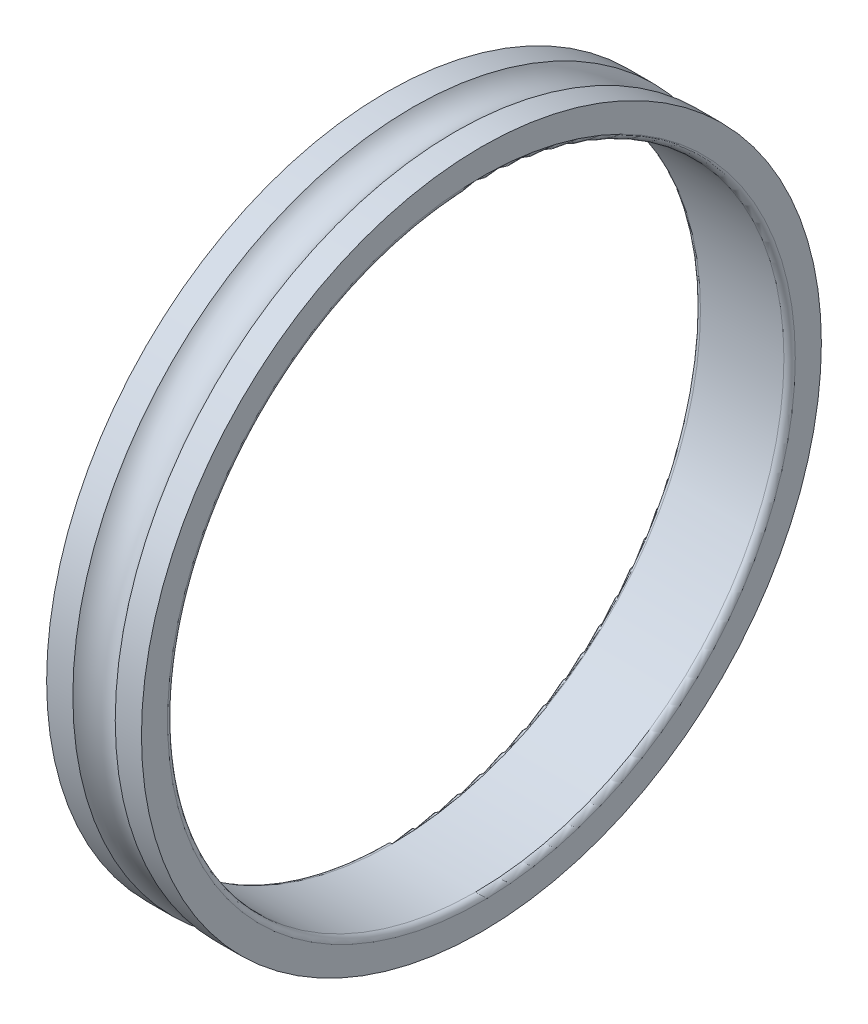
ISO-10303-21;
HEADER;
FILE_DESCRIPTION(('STEP AP214'),'2;1');
FILE_NAME('part.step','',(''),(''),'','','');
FILE_SCHEMA(('AUTOMOTIVE_DESIGN { 1 0 10303 214 1 1 1 1 }'));
ENDSEC;
DATA;
#1=APPLICATION_CONTEXT('core data for automotive mechanical design processes');
#2=APPLICATION_PROTOCOL_DEFINITION('international standard','automotive_design',2000,#1);
#3=PRODUCT_CONTEXT('',#1,'mechanical');
#4=PRODUCT('Part','Part','',(#3));
#5=PRODUCT_RELATED_PRODUCT_CATEGORY('part','',(#4));
#6=PRODUCT_DEFINITION_FORMATION('','',#4);
#7=PRODUCT_DEFINITION_CONTEXT('part definition',#1,'design');
#8=PRODUCT_DEFINITION('design','',#6,#7);
#9=PRODUCT_DEFINITION_SHAPE('','',#8);
#10=(LENGTH_UNIT() NAMED_UNIT(*) SI_UNIT(.MILLI.,.METRE.));
#11=(NAMED_UNIT(*) PLANE_ANGLE_UNIT() SI_UNIT($,.RADIAN.));
#12=(NAMED_UNIT(*) SI_UNIT($,.STERADIAN.) SOLID_ANGLE_UNIT());
#13=UNCERTAINTY_MEASURE_WITH_UNIT(LENGTH_MEASURE(1.E-05),#10,'distance_accuracy_value','');
#14=(GEOMETRIC_REPRESENTATION_CONTEXT(3) GLOBAL_UNCERTAINTY_ASSIGNED_CONTEXT((#13)) GLOBAL_UNIT_ASSIGNED_CONTEXT((#10,
#11,#12)) REPRESENTATION_CONTEXT('',''));
#15=CARTESIAN_POINT('',(0.,0.,0.));
#16=DIRECTION('',(0.,0.,1.));
#17=DIRECTION('',(1.,0.,0.));
#18=AXIS2_PLACEMENT_3D('',#15,#16,#17);
#19=CARTESIAN_POINT('',(-0.00126618526032918,0.,0.));
#20=DIRECTION('',(1.,0.,0.));
#21=DIRECTION('',(0.,0.,-1.));
#22=AXIS2_PLACEMENT_3D('',#19,#20,#21);
#23=CYLINDRICAL_SURFACE('',#22,35.85);
#24=CARTESIAN_POINT('',(0.,0.,0.));
#25=DIRECTION('',(1.,0.,0.));
#26=DIRECTION('',(0.,0.,-1.));
#27=AXIS2_PLACEMENT_3D('',#24,#25,#26);
#28=CIRCLE('',#27,35.85);
#29=CARTESIAN_POINT('',(0.,0.,-35.85));
#30=VERTEX_POINT('',#29);
#31=EDGE_CURVE('E10',#30,#30,#28,.T.);
#32=ORIENTED_EDGE('',*,*,#31,.T.);
#33=EDGE_LOOP('',(#32));
#34=FACE_BOUND('',#33,.T.);
#35=CARTESIAN_POINT('',(2.7650986598957,0.,0.));
#36=DIRECTION('',(1.,0.,0.));
#37=DIRECTION('',(0.,0.,-1.));
#38=AXIS2_PLACEMENT_3D('',#35,#36,#37);
#39=CIRCLE('',#38,35.85);
#40=CARTESIAN_POINT('',(2.7650986598957,0.,-35.85));
#41=VERTEX_POINT('',#40);
#42=EDGE_CURVE('E60',#41,#41,#39,.T.);
#43=ORIENTED_EDGE('',*,*,#42,.F.);
#44=EDGE_LOOP('',(#43));
#45=FACE_BOUND('',#44,.T.);
#46=ADVANCED_FACE('F32',(#34,#45),#23,.T.);
#47=CARTESIAN_POINT('',(0.,35.85,0.));
#48=DIRECTION('',(-1.,0.,0.));
#49=DIRECTION('',(0.,0.,1.));
#50=AXIS2_PLACEMENT_3D('',#47,#48,#49);
#51=PLANE('',#50);
#52=CARTESIAN_POINT('',(0.,0.,0.));
#53=DIRECTION('',(1.,0.,0.));
#54=DIRECTION('',(0.,0.,-1.));
#55=AXIS2_PLACEMENT_3D('',#52,#53,#54);
#56=CIRCLE('',#55,33.1);
#57=CARTESIAN_POINT('',(0.,0.,-33.1));
#58=VERTEX_POINT('',#57);
#59=EDGE_CURVE('E38',#58,#58,#56,.T.);
#60=ORIENTED_EDGE('',*,*,#59,.T.);
#61=EDGE_LOOP('',(#60));
#62=FACE_BOUND('',#61,.T.);
#63=ORIENTED_EDGE('',*,*,#31,.F.);
#64=EDGE_LOOP('',(#63));
#65=FACE_BOUND('',#64,.T.);
#66=ADVANCED_FACE('F68',(#62,#65),#51,.T.);
#67=CARTESIAN_POINT('',(0.600000000017342,0.,0.));
#68=DIRECTION('',(1.,0.,0.));
#69=DIRECTION('',(0.,0.,-1.));
#70=AXIS2_PLACEMENT_3D('',#67,#68,#69);
#71=TOROIDAL_SURFACE('',#70,33.1,0.600000000017339);
#72=CARTESIAN_POINT('',(0.600000000017342,0.,0.));
#73=DIRECTION('',(1.,0.,0.));
#74=DIRECTION('',(0.,0.,-1.));
#75=AXIS2_PLACEMENT_3D('',#72,#73,#74);
#76=CIRCLE('',#75,32.4999999999827);
#77=CARTESIAN_POINT('',(0.600000000017342,0.,-32.4999999999827));
#78=VERTEX_POINT('',#77);
#79=EDGE_CURVE('E42',#78,#78,#76,.T.);
#80=ORIENTED_EDGE('',*,*,#79,.T.);
#81=EDGE_LOOP('',(#80));
#82=FACE_BOUND('',#81,.T.);
#83=ORIENTED_EDGE('',*,*,#59,.F.);
#84=EDGE_LOOP('',(#83));
#85=FACE_BOUND('',#84,.T.);
#86=ADVANCED_FACE('F72',(#82,#85),#71,.T.);
#87=CARTESIAN_POINT('',(-0.00126618526032918,0.,0.));
#88=DIRECTION('',(1.,0.,0.));
#89=DIRECTION('',(0.,0.,-1.));
#90=AXIS2_PLACEMENT_3D('',#87,#88,#89);
#91=CYLINDRICAL_SURFACE('',#90,32.4999999999827);
#92=CARTESIAN_POINT('',(9.40000000001747,0.,0.));
#93=DIRECTION('',(1.,0.,0.));
#94=DIRECTION('',(0.,0.,-1.));
#95=AXIS2_PLACEMENT_3D('',#92,#93,#94);
#96=CIRCLE('',#95,32.4999999999826);
#97=CARTESIAN_POINT('',(9.40000000001747,0.,-32.4999999999826));
#98=VERTEX_POINT('',#97);
#99=EDGE_CURVE('E46',#98,#98,#96,.T.);
#100=ORIENTED_EDGE('',*,*,#99,.T.);
#101=EDGE_LOOP('',(#100));
#102=FACE_BOUND('',#101,.T.);
#103=ORIENTED_EDGE('',*,*,#79,.F.);
#104=EDGE_LOOP('',(#103));
#105=FACE_BOUND('',#104,.T.);
#106=ADVANCED_FACE('F76',(#102,#105),#91,.F.);
#107=CARTESIAN_POINT('',(9.40000000001747,0.,0.));
#108=DIRECTION('',(1.,0.,0.));
#109=DIRECTION('',(0.,0.,-1.));
#110=AXIS2_PLACEMENT_3D('',#107,#108,#109);
#111=TOROIDAL_SURFACE('',#110,33.0999999999826,0.599999999999965);
#112=CARTESIAN_POINT('',(10.0000000000174,0.,0.));
#113=DIRECTION('',(1.,0.,0.));
#114=DIRECTION('',(0.,0.,-1.));
#115=AXIS2_PLACEMENT_3D('',#112,#113,#114);
#116=CIRCLE('',#115,33.0999999999826);
#117=CARTESIAN_POINT('',(10.0000000000174,0.,-33.0999999999826));
#118=VERTEX_POINT('',#117);
#119=EDGE_CURVE('E51',#118,#118,#116,.T.);
#120=ORIENTED_EDGE('',*,*,#119,.T.);
#121=EDGE_LOOP('',(#120));
#122=FACE_BOUND('',#121,.T.);
#123=ORIENTED_EDGE('',*,*,#99,.F.);
#124=EDGE_LOOP('',(#123));
#125=FACE_BOUND('',#124,.T.);
#126=ADVANCED_FACE('F83',(#122,#125),#111,.T.);
#127=CARTESIAN_POINT('',(10.0000000000174,33.0999999999826,0.));
#128=DIRECTION('',(1.,0.,0.));
#129=DIRECTION('',(0.,0.,-1.));
#130=AXIS2_PLACEMENT_3D('',#127,#128,#129);
#131=PLANE('',#130);
#132=CARTESIAN_POINT('',(10.0000000000174,0.,0.));
#133=DIRECTION('',(1.,0.,0.));
#134=DIRECTION('',(0.,0.,-1.));
#135=AXIS2_PLACEMENT_3D('',#132,#133,#134);
#136=CIRCLE('',#135,35.85);
#137=CARTESIAN_POINT('',(10.0000000000174,0.,-35.85));
#138=VERTEX_POINT('',#137);
#139=EDGE_CURVE('E54',#138,#138,#136,.T.);
#140=ORIENTED_EDGE('',*,*,#139,.T.);
#141=EDGE_LOOP('',(#140));
#142=FACE_BOUND('',#141,.T.);
#143=ORIENTED_EDGE('',*,*,#119,.F.);
#144=EDGE_LOOP('',(#143));
#145=FACE_BOUND('',#144,.T.);
#146=ADVANCED_FACE('F87',(#142,#145),#131,.T.);
#147=CARTESIAN_POINT('',(-0.00126618526032918,0.,0.));
#148=DIRECTION('',(1.,0.,0.));
#149=DIRECTION('',(0.,0.,-1.));
#150=AXIS2_PLACEMENT_3D('',#147,#148,#149);
#151=CYLINDRICAL_SURFACE('',#150,35.85);
#152=CARTESIAN_POINT('',(7.2349013401043,0.,0.));
#153=DIRECTION('',(1.,0.,0.));
#154=DIRECTION('',(0.,0.,-1.));
#155=AXIS2_PLACEMENT_3D('',#152,#153,#154);
#156=CIRCLE('',#155,35.85);
#157=CARTESIAN_POINT('',(7.2349013401043,0.,-35.85));
#158=VERTEX_POINT('',#157);
#159=EDGE_CURVE('E57',#158,#158,#156,.T.);
#160=ORIENTED_EDGE('',*,*,#159,.T.);
#161=EDGE_LOOP('',(#160));
#162=FACE_BOUND('',#161,.T.);
#163=ORIENTED_EDGE('',*,*,#139,.F.);
#164=EDGE_LOOP('',(#163));
#165=FACE_BOUND('',#164,.T.);
#166=ADVANCED_FACE('F91',(#162,#165),#151,.T.);
#167=CARTESIAN_POINT('',(5.,0.,0.));
#168=DIRECTION('',(1.,0.,0.));
#169=DIRECTION('',(0.,0.,-1.));
#170=AXIS2_PLACEMENT_3D('',#167,#168,#169);
#171=TOROIDAL_SURFACE('',#170,37.5,2.778);
#172=ORIENTED_EDGE('',*,*,#42,.T.);
#173=EDGE_LOOP('',(#172));
#174=FACE_BOUND('',#173,.T.);
#175=ORIENTED_EDGE('',*,*,#159,.F.);
#176=EDGE_LOOP('',(#175));
#177=FACE_BOUND('',#176,.T.);
#178=ADVANCED_FACE('F64',(#174,#177),#171,.F.);
#179=CLOSED_SHELL('',(#46,#66,#86,#106,#126,#146,#166,#178));
#180=MANIFOLD_SOLID_BREP('B2',#179);
#181=ADVANCED_BREP_SHAPE_REPRESENTATION('',(#18,#180),#14);
#182=SHAPE_DEFINITION_REPRESENTATION(#9,#181);
ENDSEC;
END-ISO-10303-21;
